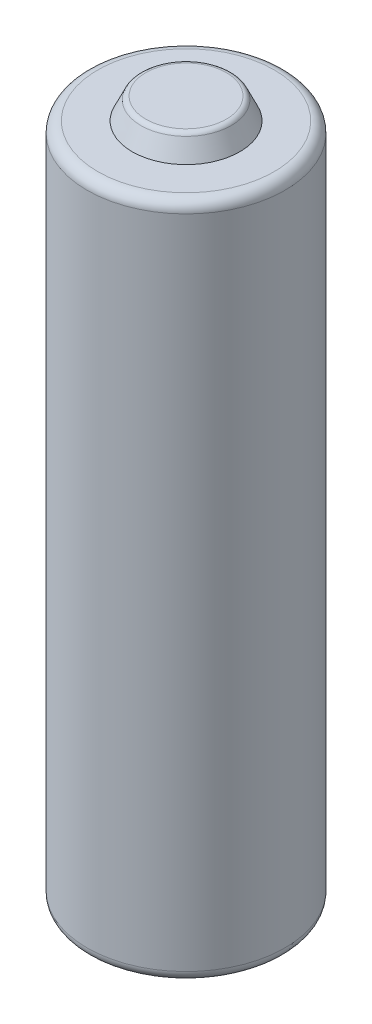
ISO-10303-21;
HEADER;
FILE_DESCRIPTION(('STEP AP214'),'2;1');
FILE_NAME('part.step','',(''),(''),'','','');
FILE_SCHEMA(('AUTOMOTIVE_DESIGN { 1 0 10303 214 1 1 1 1 }'));
ENDSEC;
DATA;
#1=APPLICATION_CONTEXT('core data for automotive mechanical design processes');
#2=APPLICATION_PROTOCOL_DEFINITION('international standard','automotive_design',2000,#1);
#3=PRODUCT_CONTEXT('',#1,'mechanical');
#4=PRODUCT('Part','Part','',(#3));
#5=PRODUCT_RELATED_PRODUCT_CATEGORY('part','',(#4));
#6=PRODUCT_DEFINITION_FORMATION('','',#4);
#7=PRODUCT_DEFINITION_CONTEXT('part definition',#1,'design');
#8=PRODUCT_DEFINITION('design','',#6,#7);
#9=PRODUCT_DEFINITION_SHAPE('','',#8);
#10=(LENGTH_UNIT() NAMED_UNIT(*) SI_UNIT(.MILLI.,.METRE.));
#11=(NAMED_UNIT(*) PLANE_ANGLE_UNIT() SI_UNIT($,.RADIAN.));
#12=(NAMED_UNIT(*) SI_UNIT($,.STERADIAN.) SOLID_ANGLE_UNIT());
#13=UNCERTAINTY_MEASURE_WITH_UNIT(LENGTH_MEASURE(1.E-05),#10,'distance_accuracy_value','');
#14=(GEOMETRIC_REPRESENTATION_CONTEXT(3) GLOBAL_UNCERTAINTY_ASSIGNED_CONTEXT((#13)) GLOBAL_UNIT_ASSIGNED_CONTEXT((#10,
#11,#12)) REPRESENTATION_CONTEXT('',''));
#15=CARTESIAN_POINT('',(0.,0.,0.));
#16=DIRECTION('',(0.,0.,1.));
#17=DIRECTION('',(1.,0.,0.));
#18=AXIS2_PLACEMENT_3D('',#15,#16,#17);
#19=CARTESIAN_POINT('',(0.,63.,0.));
#20=DIRECTION('',(0.,-1.,0.));
#21=DIRECTION('',(0.,0.,-1.));
#22=AXIS2_PLACEMENT_3D('',#19,#20,#21);
#23=CYLINDRICAL_SURFACE('',#22,9.2);
#24=CARTESIAN_POINT('',(0.,1.,0.));
#25=DIRECTION('',(0.,1.,0.));
#26=DIRECTION('',(0.,0.,1.));
#27=AXIS2_PLACEMENT_3D('',#24,#25,#26);
#28=CIRCLE('',#27,9.2);
#29=CARTESIAN_POINT('',(0.,1.,9.2));
#30=VERTEX_POINT('',#29);
#31=EDGE_CURVE('E39',#30,#30,#28,.T.);
#32=ORIENTED_EDGE('',*,*,#31,.T.);
#33=EDGE_LOOP('',(#32));
#34=FACE_BOUND('',#33,.T.);
#35=CARTESIAN_POINT('',(0.,62.,0.));
#36=DIRECTION('',(0.,1.,0.));
#37=DIRECTION('',(0.,0.,1.));
#38=AXIS2_PLACEMENT_3D('',#35,#36,#37);
#39=CIRCLE('',#38,9.2);
#40=CARTESIAN_POINT('',(0.,62.,9.2));
#41=VERTEX_POINT('',#40);
#42=EDGE_CURVE('E52',#41,#41,#39,.F.);
#43=ORIENTED_EDGE('',*,*,#42,.T.);
#44=EDGE_LOOP('',(#43));
#45=FACE_BOUND('',#44,.T.);
#46=ADVANCED_FACE('F32',(#34,#45),#23,.T.);
#47=CARTESIAN_POINT('',(0.,63.,0.));
#48=DIRECTION('',(0.,1.,0.));
#49=DIRECTION('',(0.,0.,1.));
#50=AXIS2_PLACEMENT_3D('',#47,#48,#49);
#51=PLANE('',#50);
#52=CARTESIAN_POINT('',(0.,63.,0.));
#53=DIRECTION('',(0.,1.,0.));
#54=DIRECTION('',(0.,0.,1.));
#55=AXIS2_PLACEMENT_3D('',#52,#53,#54);
#56=CIRCLE('',#55,8.2);
#57=CARTESIAN_POINT('',(0.,63.,8.2));
#58=VERTEX_POINT('',#57);
#59=EDGE_CURVE('E55',#58,#58,#56,.T.);
#60=ORIENTED_EDGE('',*,*,#59,.T.);
#61=EDGE_LOOP('',(#60));
#62=FACE_BOUND('',#61,.T.);
#63=CARTESIAN_POINT('',(0.,63.,0.));
#64=DIRECTION('',(0.,1.,0.));
#65=DIRECTION('',(0.,0.,1.));
#66=AXIS2_PLACEMENT_3D('',#63,#64,#65);
#67=CIRCLE('',#66,4.99738728551368);
#68=CARTESIAN_POINT('',(0.,63.,4.99738728551368));
#69=VERTEX_POINT('',#68);
#70=EDGE_CURVE('E58',#69,#69,#67,.T.);
#71=ORIENTED_EDGE('',*,*,#70,.F.);
#72=EDGE_LOOP('',(#71));
#73=FACE_BOUND('',#72,.T.);
#74=ADVANCED_FACE('F89',(#62,#73),#51,.T.);
#75=CARTESIAN_POINT('',(0.,0.,0.));
#76=DIRECTION('',(0.,1.,0.));
#77=DIRECTION('',(0.,0.,1.));
#78=AXIS2_PLACEMENT_3D('',#75,#76,#77);
#79=PLANE('',#78);
#80=CARTESIAN_POINT('',(0.,0.,0.));
#81=DIRECTION('',(0.,1.,0.));
#82=DIRECTION('',(0.,0.,1.));
#83=AXIS2_PLACEMENT_3D('',#80,#81,#82);
#84=CIRCLE('',#83,8.2);
#85=CARTESIAN_POINT('',(0.,0.,8.2));
#86=VERTEX_POINT('',#85);
#87=EDGE_CURVE('E10',#86,#86,#84,.F.);
#88=ORIENTED_EDGE('',*,*,#87,.T.);
#89=EDGE_LOOP('',(#88));
#90=FACE_BOUND('',#89,.T.);
#91=CARTESIAN_POINT('',(0.,0.,0.));
#92=DIRECTION('',(0.,-1.,0.));
#93=DIRECTION('',(0.,0.,-1.));
#94=AXIS2_PLACEMENT_3D('',#91,#92,#93);
#95=CIRCLE('',#94,7.00167494009295);
#96=CARTESIAN_POINT('',(0.,0.,-7.00167494009295));
#97=VERTEX_POINT('',#96);
#98=EDGE_CURVE('E64',#97,#97,#95,.T.);
#99=ORIENTED_EDGE('',*,*,#98,.F.);
#100=EDGE_LOOP('',(#99));
#101=FACE_BOUND('',#100,.T.);
#102=ADVANCED_FACE('F84',(#90,#101),#79,.F.);
#103=CARTESIAN_POINT('',(0.,63.,0.));
#104=DIRECTION('',(0.,-1.,0.));
#105=DIRECTION('',(0.,0.,1.));
#106=AXIS2_PLACEMENT_3D('',#103,#104,#105);
#107=CONICAL_SURFACE('',#106,4.99738728551368,0.436332312998583);
#108=CARTESIAN_POINT('',(0.,64.7113091308703,0.));
#109=DIRECTION('',(0.,-1.,0.));
#110=DIRECTION('',(0.,0.,-1.));
#111=AXIS2_PLACEMENT_3D('',#108,#109,#110);
#112=CIRCLE('',#111,4.19939073231826);
#113=CARTESIAN_POINT('',(0.,64.7113091308703,-4.19939073231826));
#114=VERTEX_POINT('',#113);
#115=EDGE_CURVE('E43',#114,#114,#112,.T.);
#116=ORIENTED_EDGE('',*,*,#115,.T.);
#117=EDGE_LOOP('',(#116));
#118=FACE_BOUND('',#117,.T.);
#119=ORIENTED_EDGE('',*,*,#70,.T.);
#120=EDGE_LOOP('',(#119));
#121=FACE_BOUND('',#120,.T.);
#122=ADVANCED_FACE('F112',(#118,#121),#107,.T.);
#123=CARTESIAN_POINT('',(0.,65.,0.));
#124=DIRECTION('',(0.,1.,0.));
#125=DIRECTION('',(0.,0.,1.));
#126=AXIS2_PLACEMENT_3D('',#123,#124,#125);
#127=PLANE('',#126);
#128=CARTESIAN_POINT('',(0.,65.,0.));
#129=DIRECTION('',(0.,1.,0.));
#130=DIRECTION('',(0.,0.,1.));
#131=AXIS2_PLACEMENT_3D('',#128,#129,#130);
#132=CIRCLE('',#131,3.74623683879993);
#133=CARTESIAN_POINT('',(0.,65.,3.74623683879993));
#134=VERTEX_POINT('',#133);
#135=EDGE_CURVE('E47',#134,#134,#132,.T.);
#136=ORIENTED_EDGE('',*,*,#135,.T.);
#137=EDGE_LOOP('',(#136));
#138=FACE_BOUND('',#137,.T.);
#139=ADVANCED_FACE('F85',(#138),#127,.T.);
#140=CARTESIAN_POINT('',(0.,0.,0.));
#141=DIRECTION('',(0.,-1.,0.));
#142=DIRECTION('',(0.,0.,-1.));
#143=AXIS2_PLACEMENT_3D('',#140,#141,#142);
#144=CONICAL_SURFACE('',#143,7.00167494009295,0.436332312998583);
#145=ORIENTED_EDGE('',*,*,#98,.T.);
#146=EDGE_LOOP('',(#145));
#147=FACE_BOUND('',#146,.T.);
#148=CARTESIAN_POINT('',(0.,1.06929569915336,0.));
#149=DIRECTION('',(0.,-1.,0.));
#150=DIRECTION('',(0.,0.,-1.));
#151=AXIS2_PLACEMENT_3D('',#148,#149,#150);
#152=CIRCLE('',#151,6.50305416674554);
#153=CARTESIAN_POINT('',(0.,1.06929569915336,-6.50305416674554));
#154=VERTEX_POINT('',#153);
#155=EDGE_CURVE('E61',#154,#154,#152,.T.);
#156=ORIENTED_EDGE('',*,*,#155,.F.);
#157=EDGE_LOOP('',(#156));
#158=FACE_BOUND('',#157,.T.);
#159=ADVANCED_FACE('F75',(#147,#158),#144,.F.);
#160=CARTESIAN_POINT('',(0.,0.,0.));
#161=DIRECTION('',(0.,1.,0.));
#162=DIRECTION('',(0.,0.,-1.));
#163=AXIS2_PLACEMENT_3D('',#160,#161,#162);
#164=CONICAL_SURFACE('',#163,6.00443339339812,0.436332312998583);
#165=ORIENTED_EDGE('',*,*,#155,.T.);
#166=EDGE_LOOP('',(#165));
#167=FACE_BOUND('',#166,.T.);
#168=CARTESIAN_POINT('',(0.,0.,0.));
#169=DIRECTION('',(0.,-1.,0.));
#170=DIRECTION('',(0.,0.,-1.));
#171=AXIS2_PLACEMENT_3D('',#168,#169,#170);
#172=CIRCLE('',#171,6.00443339339812);
#173=CARTESIAN_POINT('',(0.,0.,-6.00443339339812));
#174=VERTEX_POINT('',#173);
#175=EDGE_CURVE('E67',#174,#174,#172,.T.);
#176=ORIENTED_EDGE('',*,*,#175,.F.);
#177=EDGE_LOOP('',(#176));
#178=FACE_BOUND('',#177,.T.);
#179=ADVANCED_FACE('F73',(#167,#178),#164,.T.);
#180=ORIENTED_EDGE('',*,*,#175,.T.);
#181=EDGE_LOOP('',(#180));
#182=FACE_BOUND('',#181,.T.);
#183=ADVANCED_FACE('F71',(#182),#79,.F.);
#184=CARTESIAN_POINT('',(0.,62.,0.));
#185=DIRECTION('',(0.,1.,0.));
#186=DIRECTION('',(0.,0.,1.));
#187=AXIS2_PLACEMENT_3D('',#184,#185,#186);
#188=TOROIDAL_SURFACE('',#187,8.2,1.);
#189=ORIENTED_EDGE('',*,*,#42,.F.);
#190=EDGE_LOOP('',(#189));
#191=FACE_BOUND('',#190,.T.);
#192=ORIENTED_EDGE('',*,*,#59,.F.);
#193=EDGE_LOOP('',(#192));
#194=FACE_BOUND('',#193,.T.);
#195=ADVANCED_FACE('F82',(#191,#194),#188,.T.);
#196=CARTESIAN_POINT('',(0.,64.5,0.));
#197=DIRECTION('',(0.,1.,0.));
#198=DIRECTION('',(0.,0.,1.));
#199=AXIS2_PLACEMENT_3D('',#196,#197,#198);
#200=TOROIDAL_SURFACE('',#199,3.74623683879993,0.5);
#201=ORIENTED_EDGE('',*,*,#115,.F.);
#202=EDGE_LOOP('',(#201));
#203=FACE_BOUND('',#202,.T.);
#204=ORIENTED_EDGE('',*,*,#135,.F.);
#205=EDGE_LOOP('',(#204));
#206=FACE_BOUND('',#205,.T.);
#207=ADVANCED_FACE('F99',(#203,#206),#200,.T.);
#208=CARTESIAN_POINT('',(0.,1.,0.));
#209=DIRECTION('',(0.,1.,0.));
#210=DIRECTION('',(0.,0.,1.));
#211=AXIS2_PLACEMENT_3D('',#208,#209,#210);
#212=TOROIDAL_SURFACE('',#211,8.2,1.);
#213=ORIENTED_EDGE('',*,*,#87,.F.);
#214=EDGE_LOOP('',(#213));
#215=FACE_BOUND('',#214,.T.);
#216=ORIENTED_EDGE('',*,*,#31,.F.);
#217=EDGE_LOOP('',(#216));
#218=FACE_BOUND('',#217,.T.);
#219=ADVANCED_FACE('F34',(#215,#218),#212,.T.);
#220=CLOSED_SHELL('',(#46,#74,#102,#122,#139,#159,#179,#183,#195,#207,#219));
#221=MANIFOLD_SOLID_BREP('B2',#220);
#222=ADVANCED_BREP_SHAPE_REPRESENTATION('',(#18,#221),#14);
#223=SHAPE_DEFINITION_REPRESENTATION(#9,#222);
ENDSEC;
END-ISO-10303-21;
